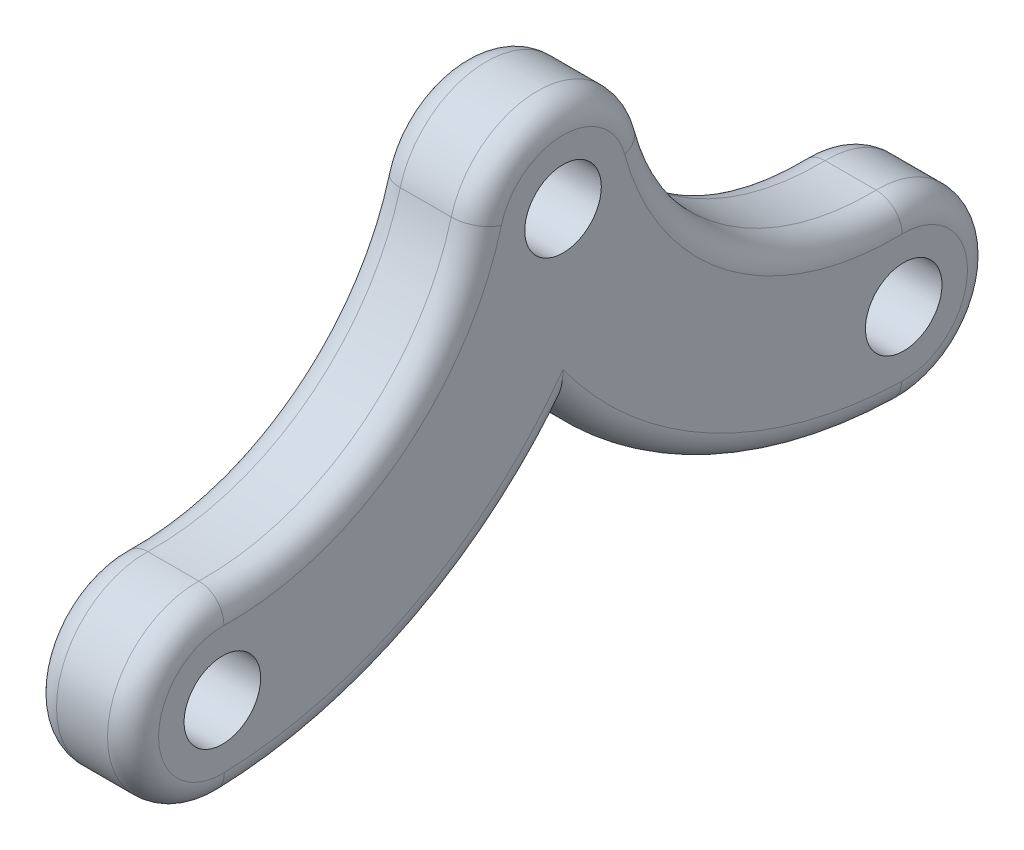
ISO-10303-21;
HEADER;
FILE_DESCRIPTION(('STEP AP214'),'2;1');
FILE_NAME('part.step','',(''),(''),'','','');
FILE_SCHEMA(('AUTOMOTIVE_DESIGN { 1 0 10303 214 1 1 1 1 }'));
ENDSEC;
DATA;
#1=APPLICATION_CONTEXT('core data for automotive mechanical design processes');
#2=APPLICATION_PROTOCOL_DEFINITION('international standard','automotive_design',2000,#1);
#3=PRODUCT_CONTEXT('',#1,'mechanical');
#4=PRODUCT('Part','Part','',(#3));
#5=PRODUCT_RELATED_PRODUCT_CATEGORY('part','',(#4));
#6=PRODUCT_DEFINITION_FORMATION('','',#4);
#7=PRODUCT_DEFINITION_CONTEXT('part definition',#1,'design');
#8=PRODUCT_DEFINITION('design','',#6,#7);
#9=PRODUCT_DEFINITION_SHAPE('','',#8);
#10=(LENGTH_UNIT() NAMED_UNIT(*) SI_UNIT(.MILLI.,.METRE.));
#11=(NAMED_UNIT(*) PLANE_ANGLE_UNIT() SI_UNIT($,.RADIAN.));
#12=(NAMED_UNIT(*) SI_UNIT($,.STERADIAN.) SOLID_ANGLE_UNIT());
#13=UNCERTAINTY_MEASURE_WITH_UNIT(LENGTH_MEASURE(1.E-05),#10,'distance_accuracy_value','');
#14=(GEOMETRIC_REPRESENTATION_CONTEXT(3) GLOBAL_UNCERTAINTY_ASSIGNED_CONTEXT((#13)) GLOBAL_UNIT_ASSIGNED_CONTEXT((#10,
#11,#12)) REPRESENTATION_CONTEXT('',''));
#15=CARTESIAN_POINT('',(0.,0.,0.));
#16=DIRECTION('',(0.,0.,1.));
#17=DIRECTION('',(1.,0.,0.));
#18=AXIS2_PLACEMENT_3D('',#15,#16,#17);
#19=CARTESIAN_POINT('',(40.,-100.,-133.5));
#20=DIRECTION('',(-1.,0.,0.));
#21=DIRECTION('',(0.,0.,1.));
#22=AXIS2_PLACEMENT_3D('',#19,#20,#21);
#23=CYLINDRICAL_SURFACE('',#22,35.);
#24=DIRECTION('',(-1.,0.,0.));
#25=VECTOR('',#24,1.);
#26=CARTESIAN_POINT('',(40.,-134.984160172439,-132.44712914889));
#27=LINE('',#26,#25);
#28=CARTESIAN_POINT('',(30.,-134.984160172439,-132.44712914889));
#29=VERTEX_POINT('',#28);
#30=CARTESIAN_POINT('',(10.,-134.984160172439,-132.44712914889));
#31=VERTEX_POINT('',#30);
#32=EDGE_CURVE('E148',#29,#31,#27,.T.);
#33=ORIENTED_EDGE('',*,*,#32,.T.);
#34=CARTESIAN_POINT('',(10.,-100.,-133.5));
#35=DIRECTION('',(1.,0.,0.));
#36=DIRECTION('',(0.,0.,-1.));
#37=AXIS2_PLACEMENT_3D('',#34,#35,#36);
#38=CIRCLE('',#37,35.);
#39=CARTESIAN_POINT('',(10.,-65.009266851456,-132.694646830647));
#40=VERTEX_POINT('',#39);
#41=EDGE_CURVE('E334',#31,#40,#38,.T.);
#42=ORIENTED_EDGE('',*,*,#41,.T.);
#43=DIRECTION('',(-1.,0.,0.));
#44=VECTOR('',#43,1.);
#45=CARTESIAN_POINT('',(40.,-65.009266851456,-132.694646830647));
#46=LINE('',#45,#44);
#47=CARTESIAN_POINT('',(30.,-65.009266851456,-132.694646830647));
#48=VERTEX_POINT('',#47);
#49=EDGE_CURVE('E175',#48,#40,#46,.T.);
#50=ORIENTED_EDGE('',*,*,#49,.F.);
#51=CARTESIAN_POINT('',(30.,-100.,-133.5));
#52=DIRECTION('',(1.,0.,0.));
#53=DIRECTION('',(0.,0.,-1.));
#54=AXIS2_PLACEMENT_3D('',#51,#52,#53);
#55=CIRCLE('',#54,35.);
#56=EDGE_CURVE('E332',#48,#29,#55,.F.);
#57=ORIENTED_EDGE('',*,*,#56,.T.);
#58=EDGE_LOOP('',(#33,#42,#50,#57));
#59=FACE_BOUND('',#58,.T.);
#60=ADVANCED_FACE('F40',(#59),#23,.T.);
#61=CARTESIAN_POINT('',(40.,34.9642564300982,-130.393637775354));
#62=DIRECTION('',(-1.,0.,0.));
#63=DIRECTION('',(0.,0.,1.));
#64=AXIS2_PLACEMENT_3D('',#61,#62,#63);
#65=CYLINDRICAL_SURFACE('',#64,100.);
#66=ORIENTED_EDGE('',*,*,#49,.T.);
#67=CARTESIAN_POINT('',(10.,34.9642564300982,-130.393637775354));
#68=DIRECTION('',(1.,0.,0.));
#69=DIRECTION('',(0.,0.,-1.));
#70=AXIS2_PLACEMENT_3D('',#67,#68,#69);
#71=CIRCLE('',#70,100.);
#72=CARTESIAN_POINT('',(10.,9.06480722261805,-33.8057579417586));
#73=VERTEX_POINT('',#72);
#74=EDGE_CURVE('E11',#40,#73,#71,.F.);
#75=ORIENTED_EDGE('',*,*,#74,.T.);
#76=DIRECTION('',(-1.,0.,0.));
#77=VECTOR('',#76,1.);
#78=CARTESIAN_POINT('',(40.,9.06480722261805,-33.8057579417586));
#79=LINE('',#78,#77);
#80=CARTESIAN_POINT('',(30.,9.06480722261805,-33.8057579417586));
#81=VERTEX_POINT('',#80);
#82=EDGE_CURVE('E299',#81,#73,#79,.T.);
#83=ORIENTED_EDGE('',*,*,#82,.F.);
#84=CARTESIAN_POINT('',(30.,34.9642564300982,-130.393637775354));
#85=DIRECTION('',(1.,0.,0.));
#86=DIRECTION('',(0.,0.,-1.));
#87=AXIS2_PLACEMENT_3D('',#84,#85,#86);
#88=CIRCLE('',#87,100.);
#89=EDGE_CURVE('E49',#81,#48,#88,.T.);
#90=ORIENTED_EDGE('',*,*,#89,.T.);
#91=EDGE_LOOP('',(#66,#75,#83,#90));
#92=FACE_BOUND('',#91,.T.);
#93=ADVANCED_FACE('F218',(#92),#65,.F.);
#94=CARTESIAN_POINT('',(40.,0.,0.));
#95=DIRECTION('',(-1.,0.,0.));
#96=DIRECTION('',(0.,0.,1.));
#97=AXIS2_PLACEMENT_3D('',#94,#95,#96);
#98=CYLINDRICAL_SURFACE('',#97,35.);
#99=ORIENTED_EDGE('',*,*,#82,.T.);
#100=CARTESIAN_POINT('',(10.,0.,0.));
#101=DIRECTION('',(1.,0.,0.));
#102=DIRECTION('',(0.,0.,-1.));
#103=AXIS2_PLACEMENT_3D('',#100,#101,#102);
#104=CIRCLE('',#103,35.);
#105=CARTESIAN_POINT('',(10.,9.06480722261805,33.8057579417586));
#106=VERTEX_POINT('',#105);
#107=EDGE_CURVE('E154',#73,#106,#104,.T.);
#108=ORIENTED_EDGE('',*,*,#107,.T.);
#109=DIRECTION('',(-1.,0.,0.));
#110=VECTOR('',#109,1.);
#111=CARTESIAN_POINT('',(40.,9.06480722261805,33.8057579417586));
#112=LINE('',#111,#110);
#113=CARTESIAN_POINT('',(30.,9.06480722261805,33.8057579417586));
#114=VERTEX_POINT('',#113);
#115=EDGE_CURVE('E296',#114,#106,#112,.T.);
#116=ORIENTED_EDGE('',*,*,#115,.F.);
#117=CARTESIAN_POINT('',(30.,0.,0.));
#118=DIRECTION('',(1.,0.,0.));
#119=DIRECTION('',(0.,0.,-1.));
#120=AXIS2_PLACEMENT_3D('',#117,#118,#119);
#121=CIRCLE('',#120,35.);
#122=EDGE_CURVE('E328',#114,#81,#121,.F.);
#123=ORIENTED_EDGE('',*,*,#122,.T.);
#124=EDGE_LOOP('',(#99,#108,#116,#123));
#125=FACE_BOUND('',#124,.T.);
#126=ADVANCED_FACE('F225',(#125),#98,.T.);
#127=CARTESIAN_POINT('',(40.,34.9642564300982,130.393637775354));
#128=DIRECTION('',(-1.,0.,0.));
#129=DIRECTION('',(0.,0.,1.));
#130=AXIS2_PLACEMENT_3D('',#127,#128,#129);
#131=CYLINDRICAL_SURFACE('',#130,100.);
#132=ORIENTED_EDGE('',*,*,#115,.T.);
#133=CARTESIAN_POINT('',(10.,34.9642564300982,130.393637775354));
#134=DIRECTION('',(1.,0.,0.));
#135=DIRECTION('',(0.,0.,-1.));
#136=AXIS2_PLACEMENT_3D('',#133,#134,#135);
#137=CIRCLE('',#136,100.);
#138=CARTESIAN_POINT('',(10.,-65.009266851456,132.694646830647));
#139=VERTEX_POINT('',#138);
#140=EDGE_CURVE('E326',#106,#139,#137,.F.);
#141=ORIENTED_EDGE('',*,*,#140,.T.);
#142=DIRECTION('',(-1.,0.,0.));
#143=VECTOR('',#142,1.);
#144=CARTESIAN_POINT('',(40.,-65.009266851456,132.694646830647));
#145=LINE('',#144,#143);
#146=CARTESIAN_POINT('',(30.,-65.009266851456,132.694646830647));
#147=VERTEX_POINT('',#146);
#148=EDGE_CURVE('E293',#147,#139,#145,.T.);
#149=ORIENTED_EDGE('',*,*,#148,.F.);
#150=CARTESIAN_POINT('',(30.,34.9642564300982,130.393637775354));
#151=DIRECTION('',(1.,0.,0.));
#152=DIRECTION('',(0.,0.,-1.));
#153=AXIS2_PLACEMENT_3D('',#150,#151,#152);
#154=CIRCLE('',#153,100.);
#155=EDGE_CURVE('E324',#147,#114,#154,.T.);
#156=ORIENTED_EDGE('',*,*,#155,.T.);
#157=EDGE_LOOP('',(#132,#141,#149,#156));
#158=FACE_BOUND('',#157,.T.);
#159=ADVANCED_FACE('F406',(#158),#131,.F.);
#160=CARTESIAN_POINT('',(40.,-100.,133.5));
#161=DIRECTION('',(-1.,0.,0.));
#162=DIRECTION('',(0.,0.,1.));
#163=AXIS2_PLACEMENT_3D('',#160,#161,#162);
#164=CYLINDRICAL_SURFACE('',#163,35.);
#165=ORIENTED_EDGE('',*,*,#148,.T.);
#166=CARTESIAN_POINT('',(10.,-100.,133.5));
#167=DIRECTION('',(1.,0.,0.));
#168=DIRECTION('',(0.,0.,-1.));
#169=AXIS2_PLACEMENT_3D('',#166,#167,#168);
#170=CIRCLE('',#169,35.);
#171=CARTESIAN_POINT('',(10.,-134.984160172439,132.44712914889));
#172=VERTEX_POINT('',#171);
#173=EDGE_CURVE('E322',#139,#172,#170,.T.);
#174=ORIENTED_EDGE('',*,*,#173,.T.);
#175=DIRECTION('',(-1.,0.,0.));
#176=VECTOR('',#175,1.);
#177=CARTESIAN_POINT('',(40.,-134.984160172439,132.44712914889));
#178=LINE('',#177,#176);
#179=CARTESIAN_POINT('',(30.,-134.984160172439,132.44712914889));
#180=VERTEX_POINT('',#179);
#181=EDGE_CURVE('E166',#180,#172,#178,.T.);
#182=ORIENTED_EDGE('',*,*,#181,.F.);
#183=CARTESIAN_POINT('',(30.,-100.,133.5));
#184=DIRECTION('',(1.,0.,0.));
#185=DIRECTION('',(0.,0.,-1.));
#186=AXIS2_PLACEMENT_3D('',#183,#184,#185);
#187=CIRCLE('',#186,35.);
#188=EDGE_CURVE('E320',#180,#147,#187,.F.);
#189=ORIENTED_EDGE('',*,*,#188,.T.);
#190=EDGE_LOOP('',(#165,#174,#182,#189));
#191=FACE_BOUND('',#190,.T.);
#192=ADVANCED_FACE('F403',(#191),#164,.T.);
#193=CARTESIAN_POINT('',(40.,44.9343778572482,137.861893526029));
#194=DIRECTION('',(-1.,0.,0.));
#195=DIRECTION('',(0.,0.,1.));
#196=AXIS2_PLACEMENT_3D('',#193,#194,#195);
#197=CYLINDRICAL_SURFACE('',#196,180.);
#198=ORIENTED_EDGE('',*,*,#181,.T.);
#199=CARTESIAN_POINT('',(10.,44.9343778572482,137.861893526029));
#200=DIRECTION('',(1.,0.,0.));
#201=DIRECTION('',(0.,0.,-1.));
#202=AXIS2_PLACEMENT_3D('',#199,#200,#201);
#203=CIRCLE('',#202,180.);
#204=CARTESIAN_POINT('',(10.,-70.7984969597975,0.));
#205=VERTEX_POINT('',#204);
#206=EDGE_CURVE('E165',#172,#205,#203,.T.);
#207=ORIENTED_EDGE('',*,*,#206,.T.);
#208=DIRECTION('',(-1.,0.,0.));
#209=VECTOR('',#208,1.);
#210=CARTESIAN_POINT('',(40.,-70.7984969597975,0.));
#211=LINE('',#210,#209);
#212=CARTESIAN_POINT('',(30.,-70.7984969597975,0.));
#213=VERTEX_POINT('',#212);
#214=EDGE_CURVE('E146',#213,#205,#211,.T.);
#215=ORIENTED_EDGE('',*,*,#214,.F.);
#216=CARTESIAN_POINT('',(30.,44.9343778572482,137.861893526029));
#217=DIRECTION('',(1.,0.,0.));
#218=DIRECTION('',(0.,0.,-1.));
#219=AXIS2_PLACEMENT_3D('',#216,#217,#218);
#220=CIRCLE('',#219,180.);
#221=EDGE_CURVE('E162',#213,#180,#220,.F.);
#222=ORIENTED_EDGE('',*,*,#221,.T.);
#223=EDGE_LOOP('',(#198,#207,#215,#222));
#224=FACE_BOUND('',#223,.T.);
#225=ADVANCED_FACE('F161',(#224),#197,.T.);
#226=CARTESIAN_POINT('',(40.,44.9343778572482,-137.861893526029));
#227=DIRECTION('',(-1.,0.,0.));
#228=DIRECTION('',(0.,0.,1.));
#229=AXIS2_PLACEMENT_3D('',#226,#227,#228);
#230=CYLINDRICAL_SURFACE('',#229,180.);
#231=ORIENTED_EDGE('',*,*,#214,.T.);
#232=CARTESIAN_POINT('',(10.,44.9343778572482,-137.861893526029));
#233=DIRECTION('',(1.,0.,0.));
#234=DIRECTION('',(0.,0.,-1.));
#235=AXIS2_PLACEMENT_3D('',#232,#233,#234);
#236=CIRCLE('',#235,180.);
#237=EDGE_CURVE('E153',#205,#31,#236,.T.);
#238=ORIENTED_EDGE('',*,*,#237,.T.);
#239=ORIENTED_EDGE('',*,*,#32,.F.);
#240=CARTESIAN_POINT('',(30.,44.9343778572482,-137.861893526029));
#241=DIRECTION('',(1.,0.,0.));
#242=DIRECTION('',(0.,0.,-1.));
#243=AXIS2_PLACEMENT_3D('',#240,#241,#242);
#244=CIRCLE('',#243,180.);
#245=EDGE_CURVE('E143',#29,#213,#244,.F.);
#246=ORIENTED_EDGE('',*,*,#245,.T.);
#247=EDGE_LOOP('',(#231,#238,#239,#246));
#248=FACE_BOUND('',#247,.T.);
#249=ADVANCED_FACE('F145',(#248),#230,.T.);
#250=CARTESIAN_POINT('',(40.,-100.,133.5));
#251=DIRECTION('',(-1.,0.,0.));
#252=DIRECTION('',(0.,0.,1.));
#253=AXIS2_PLACEMENT_3D('',#250,#251,#252);
#254=CYLINDRICAL_SURFACE('',#253,15.);
#255=CARTESIAN_POINT('',(40.,-100.,133.5));
#256=DIRECTION('',(1.,0.,0.));
#257=DIRECTION('',(0.,0.,-1.));
#258=AXIS2_PLACEMENT_3D('',#255,#256,#257);
#259=CIRCLE('',#258,15.);
#260=CARTESIAN_POINT('',(40.,-100.,118.5));
#261=VERTEX_POINT('',#260);
#262=EDGE_CURVE('E378',#261,#261,#259,.T.);
#263=ORIENTED_EDGE('',*,*,#262,.T.);
#264=EDGE_LOOP('',(#263));
#265=FACE_BOUND('',#264,.T.);
#266=CARTESIAN_POINT('',(0.,-100.,133.5));
#267=DIRECTION('',(1.,0.,0.));
#268=DIRECTION('',(0.,0.,-1.));
#269=AXIS2_PLACEMENT_3D('',#266,#267,#268);
#270=CIRCLE('',#269,15.);
#271=CARTESIAN_POINT('',(0.,-100.,118.5));
#272=VERTEX_POINT('',#271);
#273=EDGE_CURVE('E277',#272,#272,#270,.T.);
#274=ORIENTED_EDGE('',*,*,#273,.F.);
#275=EDGE_LOOP('',(#274));
#276=FACE_BOUND('',#275,.T.);
#277=ADVANCED_FACE('F230',(#265,#276),#254,.F.);
#278=CARTESIAN_POINT('',(40.,0.,0.));
#279=DIRECTION('',(-1.,0.,0.));
#280=DIRECTION('',(0.,0.,1.));
#281=AXIS2_PLACEMENT_3D('',#278,#279,#280);
#282=CYLINDRICAL_SURFACE('',#281,15.);
#283=CARTESIAN_POINT('',(40.,0.,0.));
#284=DIRECTION('',(1.,0.,0.));
#285=DIRECTION('',(0.,0.,-1.));
#286=AXIS2_PLACEMENT_3D('',#283,#284,#285);
#287=CIRCLE('',#286,15.);
#288=CARTESIAN_POINT('',(40.,0.,-15.));
#289=VERTEX_POINT('',#288);
#290=EDGE_CURVE('E290',#289,#289,#287,.T.);
#291=ORIENTED_EDGE('',*,*,#290,.T.);
#292=EDGE_LOOP('',(#291));
#293=FACE_BOUND('',#292,.T.);
#294=CARTESIAN_POINT('',(0.,0.,0.));
#295=DIRECTION('',(1.,0.,0.));
#296=DIRECTION('',(0.,0.,-1.));
#297=AXIS2_PLACEMENT_3D('',#294,#295,#296);
#298=CIRCLE('',#297,15.);
#299=CARTESIAN_POINT('',(0.,0.,-15.));
#300=VERTEX_POINT('',#299);
#301=EDGE_CURVE('E271',#300,#300,#298,.T.);
#302=ORIENTED_EDGE('',*,*,#301,.F.);
#303=EDGE_LOOP('',(#302));
#304=FACE_BOUND('',#303,.T.);
#305=ADVANCED_FACE('F233',(#293,#304),#282,.F.);
#306=CARTESIAN_POINT('',(40.,-100.,-133.5));
#307=DIRECTION('',(-1.,0.,0.));
#308=DIRECTION('',(0.,0.,1.));
#309=AXIS2_PLACEMENT_3D('',#306,#307,#308);
#310=CYLINDRICAL_SURFACE('',#309,15.);
#311=CARTESIAN_POINT('',(40.,-100.,-133.5));
#312=DIRECTION('',(1.,0.,0.));
#313=DIRECTION('',(0.,0.,-1.));
#314=AXIS2_PLACEMENT_3D('',#311,#312,#313);
#315=CIRCLE('',#314,15.);
#316=CARTESIAN_POINT('',(40.,-100.,-148.5));
#317=VERTEX_POINT('',#316);
#318=EDGE_CURVE('E285',#317,#317,#315,.F.);
#319=ORIENTED_EDGE('',*,*,#318,.F.);
#320=EDGE_LOOP('',(#319));
#321=FACE_BOUND('',#320,.T.);
#322=CARTESIAN_POINT('',(0.,-100.,-133.5));
#323=DIRECTION('',(1.,0.,0.));
#324=DIRECTION('',(0.,0.,-1.));
#325=AXIS2_PLACEMENT_3D('',#322,#323,#324);
#326=CIRCLE('',#325,15.);
#327=CARTESIAN_POINT('',(0.,-100.,-148.5));
#328=VERTEX_POINT('',#327);
#329=EDGE_CURVE('E282',#328,#328,#326,.F.);
#330=ORIENTED_EDGE('',*,*,#329,.T.);
#331=EDGE_LOOP('',(#330));
#332=FACE_BOUND('',#331,.T.);
#333=ADVANCED_FACE('F237',(#321,#332),#310,.F.);
#334=CARTESIAN_POINT('',(40.,0.,0.));
#335=DIRECTION('',(1.,0.,0.));
#336=DIRECTION('',(0.,0.,-1.));
#337=AXIS2_PLACEMENT_3D('',#334,#335,#336);
#338=PLANE('',#337);
#339=CARTESIAN_POINT('',(40.,-100.,133.5));
#340=DIRECTION('',(1.,0.,0.));
#341=DIRECTION('',(0.,0.,-1.));
#342=AXIS2_PLACEMENT_3D('',#339,#340,#341);
#343=CIRCLE('',#342,25.);
#344=CARTESIAN_POINT('',(40.,-75.0066191796114,132.924747736177));
#345=VERTEX_POINT('',#344);
#346=CARTESIAN_POINT('',(40.,-124.988685837457,132.747949392064));
#347=VERTEX_POINT('',#346);
#348=EDGE_CURVE('E57',#345,#347,#343,.T.);
#349=ORIENTED_EDGE('',*,*,#348,.T.);
#350=CARTESIAN_POINT('',(40.,44.9343778572482,137.861893526029));
#351=DIRECTION('',(1.,0.,0.));
#352=DIRECTION('',(0.,0.,-1.));
#353=AXIS2_PLACEMENT_3D('',#350,#351,#352);
#354=CIRCLE('',#353,170.);
#355=CARTESIAN_POINT('',(40.,-54.534704341282,0.));
#356=VERTEX_POINT('',#355);
#357=EDGE_CURVE('E345',#347,#356,#354,.T.);
#358=ORIENTED_EDGE('',*,*,#357,.T.);
#359=CARTESIAN_POINT('',(40.,44.9343778572482,-137.861893526029));
#360=DIRECTION('',(1.,0.,0.));
#361=DIRECTION('',(0.,0.,-1.));
#362=AXIS2_PLACEMENT_3D('',#359,#360,#361);
#363=CIRCLE('',#362,170.);
#364=CARTESIAN_POINT('',(40.,-124.988685837457,-132.747949392064));
#365=VERTEX_POINT('',#364);
#366=EDGE_CURVE('E178',#356,#365,#363,.T.);
#367=ORIENTED_EDGE('',*,*,#366,.T.);
#368=CARTESIAN_POINT('',(40.,-100.,-133.5));
#369=DIRECTION('',(1.,0.,0.));
#370=DIRECTION('',(0.,0.,-1.));
#371=AXIS2_PLACEMENT_3D('',#368,#369,#370);
#372=CIRCLE('',#371,25.);
#373=CARTESIAN_POINT('',(40.,-75.0066191796114,-132.924747736177));
#374=VERTEX_POINT('',#373);
#375=EDGE_CURVE('E338',#365,#374,#372,.T.);
#376=ORIENTED_EDGE('',*,*,#375,.T.);
#377=CARTESIAN_POINT('',(40.,34.9642564300982,-130.393637775354));
#378=DIRECTION('',(1.,0.,0.));
#379=DIRECTION('',(0.,0.,-1.));
#380=AXIS2_PLACEMENT_3D('',#377,#378,#379);
#381=CIRCLE('',#380,110.);
#382=CARTESIAN_POINT('',(40.,6.47486230187004,-24.146969958399));
#383=VERTEX_POINT('',#382);
#384=EDGE_CURVE('E336',#374,#383,#381,.F.);
#385=ORIENTED_EDGE('',*,*,#384,.T.);
#386=CARTESIAN_POINT('',(40.,0.,0.));
#387=DIRECTION('',(1.,0.,0.));
#388=DIRECTION('',(0.,0.,-1.));
#389=AXIS2_PLACEMENT_3D('',#386,#387,#388);
#390=CIRCLE('',#389,25.);
#391=CARTESIAN_POINT('',(40.,6.47486230187004,24.146969958399));
#392=VERTEX_POINT('',#391);
#393=EDGE_CURVE('E341',#383,#392,#390,.T.);
#394=ORIENTED_EDGE('',*,*,#393,.T.);
#395=CARTESIAN_POINT('',(40.,34.9642564300982,130.393637775354));
#396=DIRECTION('',(1.,0.,0.));
#397=DIRECTION('',(0.,0.,-1.));
#398=AXIS2_PLACEMENT_3D('',#395,#396,#397);
#399=CIRCLE('',#398,110.);
#400=EDGE_CURVE('E62',#392,#345,#399,.F.);
#401=ORIENTED_EDGE('',*,*,#400,.T.);
#402=EDGE_LOOP('',(#349,#358,#367,#376,#385,#394,#401));
#403=FACE_BOUND('',#402,.T.);
#404=ORIENTED_EDGE('',*,*,#290,.F.);
#405=EDGE_LOOP('',(#404));
#406=FACE_BOUND('',#405,.T.);
#407=ORIENTED_EDGE('',*,*,#262,.F.);
#408=EDGE_LOOP('',(#407));
#409=FACE_BOUND('',#408,.T.);
#410=ORIENTED_EDGE('',*,*,#318,.T.);
#411=EDGE_LOOP('',(#410));
#412=FACE_BOUND('',#411,.T.);
#413=ADVANCED_FACE('F367',(#403,#406,#409,#412),#338,.T.);
#414=CARTESIAN_POINT('',(0.,0.,0.));
#415=DIRECTION('',(1.,0.,0.));
#416=DIRECTION('',(0.,0.,-1.));
#417=AXIS2_PLACEMENT_3D('',#414,#415,#416);
#418=PLANE('',#417);
#419=CARTESIAN_POINT('',(0.,44.9343778572482,-137.861893526029));
#420=DIRECTION('',(1.,0.,0.));
#421=DIRECTION('',(0.,0.,-1.));
#422=AXIS2_PLACEMENT_3D('',#419,#420,#421);
#423=CIRCLE('',#422,170.);
#424=CARTESIAN_POINT('',(0.,-124.988685837457,-132.747949392064));
#425=VERTEX_POINT('',#424);
#426=CARTESIAN_POINT('',(0.,-54.534704341282,0.));
#427=VERTEX_POINT('',#426);
#428=EDGE_CURVE('E309',#425,#427,#423,.F.);
#429=ORIENTED_EDGE('',*,*,#428,.T.);
#430=CARTESIAN_POINT('',(0.,44.9343778572482,137.861893526029));
#431=DIRECTION('',(1.,0.,0.));
#432=DIRECTION('',(0.,0.,-1.));
#433=AXIS2_PLACEMENT_3D('',#430,#431,#432);
#434=CIRCLE('',#433,170.);
#435=CARTESIAN_POINT('',(0.,-124.988685837457,132.747949392064));
#436=VERTEX_POINT('',#435);
#437=EDGE_CURVE('E317',#427,#436,#434,.F.);
#438=ORIENTED_EDGE('',*,*,#437,.T.);
#439=CARTESIAN_POINT('',(0.,-100.,133.5));
#440=DIRECTION('',(1.,0.,0.));
#441=DIRECTION('',(0.,0.,-1.));
#442=AXIS2_PLACEMENT_3D('',#439,#440,#441);
#443=CIRCLE('',#442,25.);
#444=CARTESIAN_POINT('',(0.,-75.0066191796114,132.924747736177));
#445=VERTEX_POINT('',#444);
#446=EDGE_CURVE('E315',#436,#445,#443,.F.);
#447=ORIENTED_EDGE('',*,*,#446,.T.);
#448=CARTESIAN_POINT('',(0.,34.9642564300982,130.393637775354));
#449=DIRECTION('',(1.,0.,0.));
#450=DIRECTION('',(0.,0.,-1.));
#451=AXIS2_PLACEMENT_3D('',#448,#449,#450);
#452=CIRCLE('',#451,110.);
#453=CARTESIAN_POINT('',(0.,6.47486230187004,24.146969958399));
#454=VERTEX_POINT('',#453);
#455=EDGE_CURVE('E313',#445,#454,#452,.T.);
#456=ORIENTED_EDGE('',*,*,#455,.T.);
#457=CARTESIAN_POINT('',(0.,0.,0.));
#458=DIRECTION('',(1.,0.,0.));
#459=DIRECTION('',(0.,0.,-1.));
#460=AXIS2_PLACEMENT_3D('',#457,#458,#459);
#461=CIRCLE('',#460,25.);
#462=CARTESIAN_POINT('',(0.,6.47486230187004,-24.146969958399));
#463=VERTEX_POINT('',#462);
#464=EDGE_CURVE('E311',#454,#463,#461,.F.);
#465=ORIENTED_EDGE('',*,*,#464,.T.);
#466=CARTESIAN_POINT('',(0.,34.9642564300982,-130.393637775354));
#467=DIRECTION('',(1.,0.,0.));
#468=DIRECTION('',(0.,0.,-1.));
#469=AXIS2_PLACEMENT_3D('',#466,#467,#468);
#470=CIRCLE('',#469,110.);
#471=CARTESIAN_POINT('',(0.,-75.0066191796114,-132.924747736177));
#472=VERTEX_POINT('',#471);
#473=EDGE_CURVE('E305',#463,#472,#470,.T.);
#474=ORIENTED_EDGE('',*,*,#473,.T.);
#475=CARTESIAN_POINT('',(0.,-100.,-133.5));
#476=DIRECTION('',(1.,0.,0.));
#477=DIRECTION('',(0.,0.,-1.));
#478=AXIS2_PLACEMENT_3D('',#475,#476,#477);
#479=CIRCLE('',#478,25.);
#480=EDGE_CURVE('E307',#472,#425,#479,.F.);
#481=ORIENTED_EDGE('',*,*,#480,.T.);
#482=EDGE_LOOP('',(#429,#438,#447,#456,#465,#474,#481));
#483=FACE_BOUND('',#482,.T.);
#484=ORIENTED_EDGE('',*,*,#301,.T.);
#485=EDGE_LOOP('',(#484));
#486=FACE_BOUND('',#485,.T.);
#487=ORIENTED_EDGE('',*,*,#273,.T.);
#488=EDGE_LOOP('',(#487));
#489=FACE_BOUND('',#488,.T.);
#490=ORIENTED_EDGE('',*,*,#329,.F.);
#491=EDGE_LOOP('',(#490));
#492=FACE_BOUND('',#491,.T.);
#493=ADVANCED_FACE('F370',(#483,#486,#489,#492),#418,.F.);
#494=CARTESIAN_POINT('',(10.,0.,0.));
#495=DIRECTION('',(1.,0.,0.));
#496=DIRECTION('',(0.,0.,-1.));
#497=AXIS2_PLACEMENT_3D('',#494,#495,#496);
#498=TOROIDAL_SURFACE('',#497,25.,10.);
#499=CARTESIAN_POINT('',(10.,6.47486230187004,24.146969958399));
#500=DIRECTION('',(0.,-0.965878798335959,0.258994492074801));
#501=DIRECTION('',(0.,-0.258994492074801,-0.965878798335959));
#502=AXIS2_PLACEMENT_3D('',#499,#500,#501);
#503=CIRCLE('',#502,10.);
#504=EDGE_CURVE('E264',#106,#454,#503,.T.);
#505=ORIENTED_EDGE('',*,*,#504,.F.);
#506=ORIENTED_EDGE('',*,*,#107,.F.);
#507=CARTESIAN_POINT('',(10.,6.47486230187004,-24.146969958399));
#508=DIRECTION('',(0.,-0.965878798335959,-0.258994492074801));
#509=DIRECTION('',(0.,0.258994492074801,-0.965878798335959));
#510=AXIS2_PLACEMENT_3D('',#507,#508,#509);
#511=CIRCLE('',#510,10.);
#512=EDGE_CURVE('E189',#463,#73,#511,.T.);
#513=ORIENTED_EDGE('',*,*,#512,.F.);
#514=ORIENTED_EDGE('',*,*,#464,.F.);
#515=EDGE_LOOP('',(#505,#506,#513,#514));
#516=FACE_BOUND('',#515,.T.);
#517=ADVANCED_FACE('F389',(#516),#498,.T.);
#518=CARTESIAN_POINT('',(10.,34.9642564300982,-130.393637775354));
#519=DIRECTION('',(1.,0.,0.));
#520=DIRECTION('',(0.,0.,-1.));
#521=AXIS2_PLACEMENT_3D('',#518,#519,#520);
#522=TOROIDAL_SURFACE('',#521,110.,10.);
#523=ORIENTED_EDGE('',*,*,#512,.T.);
#524=ORIENTED_EDGE('',*,*,#74,.F.);
#525=CARTESIAN_POINT('',(10.,-75.0066191796114,-132.924747736177));
#526=DIRECTION('',(0.,0.0230100905529301,-0.999735232815542));
#527=DIRECTION('',(0.,0.999735232815542,0.0230100905529301));
#528=AXIS2_PLACEMENT_3D('',#525,#526,#527);
#529=CIRCLE('',#528,10.);
#530=EDGE_CURVE('E262',#472,#40,#529,.T.);
#531=ORIENTED_EDGE('',*,*,#530,.F.);
#532=ORIENTED_EDGE('',*,*,#473,.F.);
#533=EDGE_LOOP('',(#523,#524,#531,#532));
#534=FACE_BOUND('',#533,.T.);
#535=ADVANCED_FACE('F436',(#534),#522,.T.);
#536=CARTESIAN_POINT('',(10.,34.9642564300982,130.393637775354));
#537=DIRECTION('',(1.,0.,0.));
#538=DIRECTION('',(0.,0.,-1.));
#539=AXIS2_PLACEMENT_3D('',#536,#537,#538);
#540=TOROIDAL_SURFACE('',#539,110.,10.);
#541=ORIENTED_EDGE('',*,*,#504,.T.);
#542=ORIENTED_EDGE('',*,*,#455,.F.);
#543=CARTESIAN_POINT('',(10.,-75.0066191796114,132.924747736177));
#544=DIRECTION('',(0.,0.0230100905529301,0.999735232815542));
#545=DIRECTION('',(0.,-0.999735232815542,0.0230100905529301));
#546=AXIS2_PLACEMENT_3D('',#543,#544,#545);
#547=CIRCLE('',#546,10.);
#548=EDGE_CURVE('E259',#139,#445,#547,.T.);
#549=ORIENTED_EDGE('',*,*,#548,.F.);
#550=ORIENTED_EDGE('',*,*,#140,.F.);
#551=EDGE_LOOP('',(#541,#542,#549,#550));
#552=FACE_BOUND('',#551,.T.);
#553=ADVANCED_FACE('F419',(#552),#540,.T.);
#554=CARTESIAN_POINT('',(10.,-100.,-133.5));
#555=DIRECTION('',(1.,0.,0.));
#556=DIRECTION('',(0.,0.,-1.));
#557=AXIS2_PLACEMENT_3D('',#554,#555,#556);
#558=TOROIDAL_SURFACE('',#557,25.,10.);
#559=ORIENTED_EDGE('',*,*,#530,.T.);
#560=ORIENTED_EDGE('',*,*,#41,.F.);
#561=CARTESIAN_POINT('',(10.,-124.988685837457,-132.747949392064));
#562=DIRECTION('',(0.,0.0300820243174377,0.999547433498263));
#563=DIRECTION('',(0.,-0.999547433498263,0.0300820243174377));
#564=AXIS2_PLACEMENT_3D('',#561,#562,#563);
#565=CIRCLE('',#564,10.);
#566=EDGE_CURVE('E256',#425,#31,#565,.T.);
#567=ORIENTED_EDGE('',*,*,#566,.F.);
#568=ORIENTED_EDGE('',*,*,#480,.F.);
#569=EDGE_LOOP('',(#559,#560,#567,#568));
#570=FACE_BOUND('',#569,.T.);
#571=ADVANCED_FACE('F433',(#570),#558,.T.);
#572=CARTESIAN_POINT('',(10.,-100.,133.5));
#573=DIRECTION('',(1.,0.,0.));
#574=DIRECTION('',(0.,0.,-1.));
#575=AXIS2_PLACEMENT_3D('',#572,#573,#574);
#576=TOROIDAL_SURFACE('',#575,25.,10.);
#577=ORIENTED_EDGE('',*,*,#548,.T.);
#578=ORIENTED_EDGE('',*,*,#446,.F.);
#579=CARTESIAN_POINT('',(10.,-124.988685837457,132.747949392064));
#580=DIRECTION('',(0.,0.0300820243174377,-0.999547433498263));
#581=DIRECTION('',(0.,0.999547433498263,0.0300820243174377));
#582=AXIS2_PLACEMENT_3D('',#579,#580,#581);
#583=CIRCLE('',#582,10.);
#584=EDGE_CURVE('E253',#172,#436,#583,.T.);
#585=ORIENTED_EDGE('',*,*,#584,.F.);
#586=ORIENTED_EDGE('',*,*,#173,.F.);
#587=EDGE_LOOP('',(#577,#578,#585,#586));
#588=FACE_BOUND('',#587,.T.);
#589=ADVANCED_FACE('F425',(#588),#576,.T.);
#590=CARTESIAN_POINT('',(10.,44.9343778572482,-137.861893526029));
#591=DIRECTION('',(1.,0.,0.));
#592=DIRECTION('',(0.,0.,-1.));
#593=AXIS2_PLACEMENT_3D('',#590,#591,#592);
#594=TOROIDAL_SURFACE('',#593,170.,10.);
#595=ORIENTED_EDGE('',*,*,#566,.T.);
#596=ORIENTED_EDGE('',*,*,#237,.F.);
#597=CARTESIAN_POINT('',(10.,-70.7984969597975,0.));
#598=CARTESIAN_POINT('',(9.89422311013253,-70.7984996847596,0.));
#599=CARTESIAN_POINT('',(9.78846393117771,-70.7958858092505,0.));
#600=CARTESIAN_POINT('',(9.57721003732573,-70.7854586736017,0.));
#601=CARTESIAN_POINT('',(9.47171530301599,-70.7776458070431,0.));
#602=CARTESIAN_POINT('',(9.1562080557253,-70.7464845999716,0.));
#603=CARTESIAN_POINT('',(8.94690931694736,-70.7154134763796,0.));
#604=CARTESIAN_POINT('',(8.53437456403421,-70.6338481259508,0.));
#605=CARTESIAN_POINT('',(8.33109878844539,-70.583551924336,0.));
#606=CARTESIAN_POINT('',(7.92994942675454,-70.4646557576795,0.));
#607=CARTESIAN_POINT('',(7.73207683258888,-70.3960524563254,0.));
#608=CARTESIAN_POINT('',(7.34382729121588,-70.2422611680267,0.));
#609=CARTESIAN_POINT('',(7.15342358935184,-70.1571404379742,0.));
#610=CARTESIAN_POINT('',(6.78015235335447,-69.9716551414107,0.));
#611=CARTESIAN_POINT('',(6.59728788451379,-69.8712844507986,0.));
#612=CARTESIAN_POINT('',(6.0603502995828,-69.5492319298821,0.));
#613=CARTESIAN_POINT('',(5.71858299785999,-69.3068753531372,0.));
#614=CARTESIAN_POINT('',(4.91694448118171,-68.6541619958213,0.));
#615=CARTESIAN_POINT('',(4.47769622773998,-68.2185701392228,0.));
#616=CARTESIAN_POINT('',(3.87486527405323,-67.5182112598684,0.));
#617=CARTESIAN_POINT('',(3.68304046509803,-67.2765709362946,0.));
#618=CARTESIAN_POINT('',(3.31713986229896,-66.7801253395351,0.));
#619=CARTESIAN_POINT('',(3.14306387411407,-66.5253202105438,0.));
#620=CARTESIAN_POINT('',(2.72342215208374,-65.8660157377357,0.));
#621=CARTESIAN_POINT('',(2.48930874179397,-65.4542271624715,0.));
#622=CARTESIAN_POINT('',(2.05770056949286,-64.6118359949225,0.));
#623=CARTESIAN_POINT('',(1.86022608216289,-64.1812231478261,0.));
#624=CARTESIAN_POINT('',(1.49877789322888,-63.3054978095935,0.));
#625=CARTESIAN_POINT('',(1.33485483076922,-62.8603645597025,0.));
#626=CARTESIAN_POINT('',(1.03830649932706,-61.9599620760912,0.));
#627=CARTESIAN_POINT('',(0.905676332561232,-61.5046944407694,0.));
#628=CARTESIAN_POINT('',(0.65130376342371,-60.516235778784,0.));
#629=CARTESIAN_POINT('',(0.534359965107327,-59.9818133588263,0.));
#630=CARTESIAN_POINT('',(0.336278302286713,-58.9063305742752,0.));
#631=CARTESIAN_POINT('',(0.255148473898781,-58.3652687478633,0.));
#632=CARTESIAN_POINT('',(0.126618426288844,-57.2801878542804,0.));
#633=CARTESIAN_POINT('',(0.0791584787889694,-56.7361757575052,0.));
#634=CARTESIAN_POINT('',(0.0160505000566885,-55.6464801713675,0.));
#635=CARTESIAN_POINT('',(0.000390568000162189,-55.1007973838414,0.));
#636=CARTESIAN_POINT('',(2.40737335695548E-06,-54.5483912655165,0.));
#637=CARTESIAN_POINT('',(2.40668293142831E-09,-54.5415477929023,0.));
#638=CARTESIAN_POINT('',(0.,-54.534704341282,0.));
#639=B_SPLINE_CURVE_WITH_KNOTS('',3,(#597,#598,#599,#600,#601,#602,#603,#604,#605,#606,#607,
#608,#609,#610,#611,#612,#613,#614,#615,#616,#617,#618,#619,#620,#621,#622,#623,#624,#625,#626,
#627,#628,#629,#630,#631,#632,#633,#634,#635,#636,#637,#638),.UNSPECIFIED.,.F.,.F.,(4,2,2,2,2,2,
2,2,2,2,2,2,2,2,2,2,2,2,2,2,4),(0.,0.317263524254523,0.634503033332211,1.26819595481079,
1.89553022679185,2.52297890324559,3.14792435886868,3.77312144757109,5.02559820983537,
6.87063595420307,7.79566107175067,8.72067605963221,10.1395603975429,11.5592275691621,
12.9810218949838,14.4025935419297,16.0424388808276,17.6826519895591,19.319948136884,
20.9566314301933,20.9771618472176),.UNSPECIFIED.);
#640=EDGE_CURVE('E247',#427,#205,#639,.F.);
#641=ORIENTED_EDGE('',*,*,#640,.F.);
#642=ORIENTED_EDGE('',*,*,#428,.F.);
#643=EDGE_LOOP('',(#595,#596,#641,#642));
#644=FACE_BOUND('',#643,.T.);
#645=ADVANCED_FACE('F242',(#644),#594,.T.);
#646=CARTESIAN_POINT('',(10.,44.9343778572482,137.861893526029));
#647=DIRECTION('',(1.,0.,0.));
#648=DIRECTION('',(0.,0.,-1.));
#649=AXIS2_PLACEMENT_3D('',#646,#647,#648);
#650=TOROIDAL_SURFACE('',#649,170.,10.);
#651=ORIENTED_EDGE('',*,*,#584,.T.);
#652=ORIENTED_EDGE('',*,*,#437,.F.);
#653=ORIENTED_EDGE('',*,*,#640,.T.);
#654=ORIENTED_EDGE('',*,*,#206,.F.);
#655=EDGE_LOOP('',(#651,#652,#653,#654));
#656=FACE_BOUND('',#655,.T.);
#657=ADVANCED_FACE('F214',(#656),#650,.T.);
#658=CARTESIAN_POINT('',(30.,0.,0.));
#659=DIRECTION('',(1.,0.,0.));
#660=DIRECTION('',(0.,0.,-1.));
#661=AXIS2_PLACEMENT_3D('',#658,#659,#660);
#662=TOROIDAL_SURFACE('',#661,25.,10.);
#663=CARTESIAN_POINT('',(30.,6.47486230187004,24.146969958399));
#664=DIRECTION('',(0.,-0.965878798335959,0.258994492074801));
#665=DIRECTION('',(0.,-0.258994492074801,-0.965878798335959));
#666=AXIS2_PLACEMENT_3D('',#663,#664,#665);
#667=CIRCLE('',#666,10.);
#668=EDGE_CURVE('E357',#392,#114,#667,.T.);
#669=ORIENTED_EDGE('',*,*,#668,.F.);
#670=ORIENTED_EDGE('',*,*,#393,.F.);
#671=CARTESIAN_POINT('',(30.,6.47486230187004,-24.146969958399));
#672=DIRECTION('',(0.,-0.965878798335959,-0.258994492074801));
#673=DIRECTION('',(0.,0.258994492074801,-0.965878798335959));
#674=AXIS2_PLACEMENT_3D('',#671,#672,#673);
#675=CIRCLE('',#674,10.);
#676=EDGE_CURVE('E44',#81,#383,#675,.T.);
#677=ORIENTED_EDGE('',*,*,#676,.F.);
#678=ORIENTED_EDGE('',*,*,#122,.F.);
#679=EDGE_LOOP('',(#669,#670,#677,#678));
#680=FACE_BOUND('',#679,.T.);
#681=ADVANCED_FACE('F42',(#680),#662,.T.);
#682=CARTESIAN_POINT('',(30.,34.9642564300982,-130.393637775354));
#683=DIRECTION('',(1.,0.,0.));
#684=DIRECTION('',(0.,0.,-1.));
#685=AXIS2_PLACEMENT_3D('',#682,#683,#684);
#686=TOROIDAL_SURFACE('',#685,110.,10.);
#687=ORIENTED_EDGE('',*,*,#676,.T.);
#688=ORIENTED_EDGE('',*,*,#384,.F.);
#689=CARTESIAN_POINT('',(30.,-75.0066191796114,-132.924747736177));
#690=DIRECTION('',(0.,0.0230100905529301,-0.999735232815542));
#691=DIRECTION('',(0.,0.999735232815542,0.0230100905529301));
#692=AXIS2_PLACEMENT_3D('',#689,#690,#691);
#693=CIRCLE('',#692,10.);
#694=EDGE_CURVE('E355',#48,#374,#693,.T.);
#695=ORIENTED_EDGE('',*,*,#694,.F.);
#696=ORIENTED_EDGE('',*,*,#89,.F.);
#697=EDGE_LOOP('',(#687,#688,#695,#696));
#698=FACE_BOUND('',#697,.T.);
#699=ADVANCED_FACE('F207',(#698),#686,.T.);
#700=CARTESIAN_POINT('',(30.,34.9642564300982,130.393637775354));
#701=DIRECTION('',(1.,0.,0.));
#702=DIRECTION('',(0.,0.,-1.));
#703=AXIS2_PLACEMENT_3D('',#700,#701,#702);
#704=TOROIDAL_SURFACE('',#703,110.,10.);
#705=ORIENTED_EDGE('',*,*,#668,.T.);
#706=ORIENTED_EDGE('',*,*,#155,.F.);
#707=CARTESIAN_POINT('',(30.,-75.0066191796114,132.924747736177));
#708=DIRECTION('',(0.,0.0230100905529301,0.999735232815542));
#709=DIRECTION('',(0.,-0.999735232815542,0.0230100905529301));
#710=AXIS2_PLACEMENT_3D('',#707,#708,#709);
#711=CIRCLE('',#710,10.);
#712=EDGE_CURVE('E358',#345,#147,#711,.T.);
#713=ORIENTED_EDGE('',*,*,#712,.F.);
#714=ORIENTED_EDGE('',*,*,#400,.F.);
#715=EDGE_LOOP('',(#705,#706,#713,#714));
#716=FACE_BOUND('',#715,.T.);
#717=ADVANCED_FACE('F204',(#716),#704,.T.);
#718=CARTESIAN_POINT('',(30.,-100.,-133.5));
#719=DIRECTION('',(1.,0.,0.));
#720=DIRECTION('',(0.,0.,-1.));
#721=AXIS2_PLACEMENT_3D('',#718,#719,#720);
#722=TOROIDAL_SURFACE('',#721,25.,10.);
#723=ORIENTED_EDGE('',*,*,#694,.T.);
#724=ORIENTED_EDGE('',*,*,#375,.F.);
#725=CARTESIAN_POINT('',(30.,-124.988685837457,-132.747949392064));
#726=DIRECTION('',(0.,0.0300820243174377,0.999547433498263));
#727=DIRECTION('',(0.,-0.999547433498263,0.0300820243174377));
#728=AXIS2_PLACEMENT_3D('',#725,#726,#727);
#729=CIRCLE('',#728,10.);
#730=EDGE_CURVE('E180',#29,#365,#729,.T.);
#731=ORIENTED_EDGE('',*,*,#730,.F.);
#732=ORIENTED_EDGE('',*,*,#56,.F.);
#733=EDGE_LOOP('',(#723,#724,#731,#732));
#734=FACE_BOUND('',#733,.T.);
#735=ADVANCED_FACE('F200',(#734),#722,.T.);
#736=CARTESIAN_POINT('',(30.,-100.,133.5));
#737=DIRECTION('',(1.,0.,0.));
#738=DIRECTION('',(0.,0.,-1.));
#739=AXIS2_PLACEMENT_3D('',#736,#737,#738);
#740=TOROIDAL_SURFACE('',#739,25.,10.);
#741=ORIENTED_EDGE('',*,*,#712,.T.);
#742=ORIENTED_EDGE('',*,*,#188,.F.);
#743=CARTESIAN_POINT('',(30.,-124.988685837457,132.747949392064));
#744=DIRECTION('',(0.,0.0300820243174377,-0.999547433498263));
#745=DIRECTION('',(0.,0.999547433498263,0.0300820243174377));
#746=AXIS2_PLACEMENT_3D('',#743,#744,#745);
#747=CIRCLE('',#746,10.);
#748=EDGE_CURVE('E173',#347,#180,#747,.T.);
#749=ORIENTED_EDGE('',*,*,#748,.F.);
#750=ORIENTED_EDGE('',*,*,#348,.F.);
#751=EDGE_LOOP('',(#741,#742,#749,#750));
#752=FACE_BOUND('',#751,.T.);
#753=ADVANCED_FACE('F197',(#752),#740,.T.);
#754=CARTESIAN_POINT('',(30.,44.9343778572482,-137.861893526029));
#755=DIRECTION('',(1.,0.,0.));
#756=DIRECTION('',(0.,0.,-1.));
#757=AXIS2_PLACEMENT_3D('',#754,#755,#756);
#758=TOROIDAL_SURFACE('',#757,170.,10.);
#759=ORIENTED_EDGE('',*,*,#730,.T.);
#760=ORIENTED_EDGE('',*,*,#366,.F.);
#761=CARTESIAN_POINT('',(30.,-70.7984969597975,0.));
#762=CARTESIAN_POINT('',(30.1057768898675,-70.7984996847596,0.));
#763=CARTESIAN_POINT('',(30.2115360688223,-70.7958858092505,0.));
#764=CARTESIAN_POINT('',(30.4227899626743,-70.7854586736017,0.));
#765=CARTESIAN_POINT('',(30.528284696984,-70.7776458070431,0.));
#766=CARTESIAN_POINT('',(30.8437919442747,-70.7464845999716,0.));
#767=CARTESIAN_POINT('',(31.0530906830526,-70.7154134763796,0.));
#768=CARTESIAN_POINT('',(31.4656254359658,-70.6338481259508,0.));
#769=CARTESIAN_POINT('',(31.6689012115546,-70.583551924336,0.));
#770=CARTESIAN_POINT('',(32.0700505732455,-70.4646557576795,0.));
#771=CARTESIAN_POINT('',(32.2679231674111,-70.3960524563254,0.));
#772=CARTESIAN_POINT('',(32.6561727087841,-70.2422611680267,0.));
#773=CARTESIAN_POINT('',(32.8465764106482,-70.1571404379742,0.));
#774=CARTESIAN_POINT('',(33.2198476466455,-69.9716551414107,0.));
#775=CARTESIAN_POINT('',(33.4027121154862,-69.8712844507986,0.));
#776=CARTESIAN_POINT('',(33.9396497004172,-69.549231929882,0.));
#777=CARTESIAN_POINT('',(34.28141700214,-69.3068753531372,0.));
#778=CARTESIAN_POINT('',(35.0830555188183,-68.6541619958213,0.));
#779=CARTESIAN_POINT('',(35.52230377226,-68.2185701392228,0.));
#780=CARTESIAN_POINT('',(36.1251347259468,-67.5182112598684,0.));
#781=CARTESIAN_POINT('',(36.316959534902,-67.2765709362946,0.));
#782=CARTESIAN_POINT('',(36.682860137701,-66.7801253395352,0.));
#783=CARTESIAN_POINT('',(36.8569361258859,-66.5253202105438,0.));
#784=CARTESIAN_POINT('',(37.2765778479162,-65.8660157377357,0.));
#785=CARTESIAN_POINT('',(37.510691258206,-65.4542271624715,0.));
#786=CARTESIAN_POINT('',(37.9422994305071,-64.6118359949225,0.));
#787=CARTESIAN_POINT('',(38.1397739178371,-64.1812231478261,0.));
#788=CARTESIAN_POINT('',(38.5012221067711,-63.3054978095936,0.));
#789=CARTESIAN_POINT('',(38.6651451692308,-62.8603645597026,0.));
#790=CARTESIAN_POINT('',(38.9616935006729,-61.9599620760913,0.));
#791=CARTESIAN_POINT('',(39.0943236674388,-61.5046944407694,0.));
#792=CARTESIAN_POINT('',(39.3486962365763,-60.5162357787841,0.));
#793=CARTESIAN_POINT('',(39.4656400348927,-59.9818133588263,0.));
#794=CARTESIAN_POINT('',(39.6637216977133,-58.9063305742753,0.));
#795=CARTESIAN_POINT('',(39.7448515261012,-58.3652687478634,0.));
#796=CARTESIAN_POINT('',(39.8733815737112,-57.2801878542805,0.));
#797=CARTESIAN_POINT('',(39.9208415212111,-56.7361757575053,0.));
#798=CARTESIAN_POINT('',(39.9839494999433,-55.6464801713675,0.));
#799=CARTESIAN_POINT('',(39.9996094319997,-55.1007973838414,0.));
#800=CARTESIAN_POINT('',(39.9999975926266,-54.5483912655165,0.));
#801=CARTESIAN_POINT('',(39.9999999975933,-54.5415477929023,0.));
#802=CARTESIAN_POINT('',(40.,-54.534704341282,0.));
#803=B_SPLINE_CURVE_WITH_KNOTS('',3,(#761,#762,#763,#764,#765,#766,#767,#768,#769,#770,#771,
#772,#773,#774,#775,#776,#777,#778,#779,#780,#781,#782,#783,#784,#785,#786,#787,#788,#789,#790,
#791,#792,#793,#794,#795,#796,#797,#798,#799,#800,#801,#802),.UNSPECIFIED.,.F.,.F.,(4,2,2,2,2,2,
2,2,2,2,2,2,2,2,2,2,2,2,2,2,4),(0.,0.317263524254521,0.634503033332211,1.2681959548108,
1.89553022679185,2.52297890324559,3.14792435886867,3.77312144757108,5.02559820983537,
6.87063595420305,7.79566107175065,8.72067605963219,10.1395603975429,11.5592275691621,
12.9810218949837,14.4025935419296,16.0424388808275,17.682651989559,19.3199481368839,
20.9566314301933,20.9771618472175),.UNSPECIFIED.);
#804=EDGE_CURVE('E171',#213,#356,#803,.T.);
#805=ORIENTED_EDGE('',*,*,#804,.F.);
#806=ORIENTED_EDGE('',*,*,#245,.F.);
#807=EDGE_LOOP('',(#759,#760,#805,#806));
#808=FACE_BOUND('',#807,.T.);
#809=ADVANCED_FACE('F177',(#808),#758,.T.);
#810=CARTESIAN_POINT('',(30.,44.9343778572482,137.861893526029));
#811=DIRECTION('',(1.,0.,0.));
#812=DIRECTION('',(0.,0.,-1.));
#813=AXIS2_PLACEMENT_3D('',#810,#811,#812);
#814=TOROIDAL_SURFACE('',#813,170.,10.);
#815=ORIENTED_EDGE('',*,*,#748,.T.);
#816=ORIENTED_EDGE('',*,*,#221,.F.);
#817=ORIENTED_EDGE('',*,*,#804,.T.);
#818=ORIENTED_EDGE('',*,*,#357,.F.);
#819=EDGE_LOOP('',(#815,#816,#817,#818));
#820=FACE_BOUND('',#819,.T.);
#821=ADVANCED_FACE('F169',(#820),#814,.T.);
#822=CLOSED_SHELL('',(#60,#93,#126,#159,#192,#225,#249,#277,#305,#333,#413,#493,#517,#535,#553,
#571,#589,#645,#657,#681,#699,#717,#735,#753,#809,#821));
#823=MANIFOLD_SOLID_BREP('B2',#822);
#824=ADVANCED_BREP_SHAPE_REPRESENTATION('',(#18,#823),#14);
#825=SHAPE_DEFINITION_REPRESENTATION(#9,#824);
ENDSEC;
END-ISO-10303-21;
